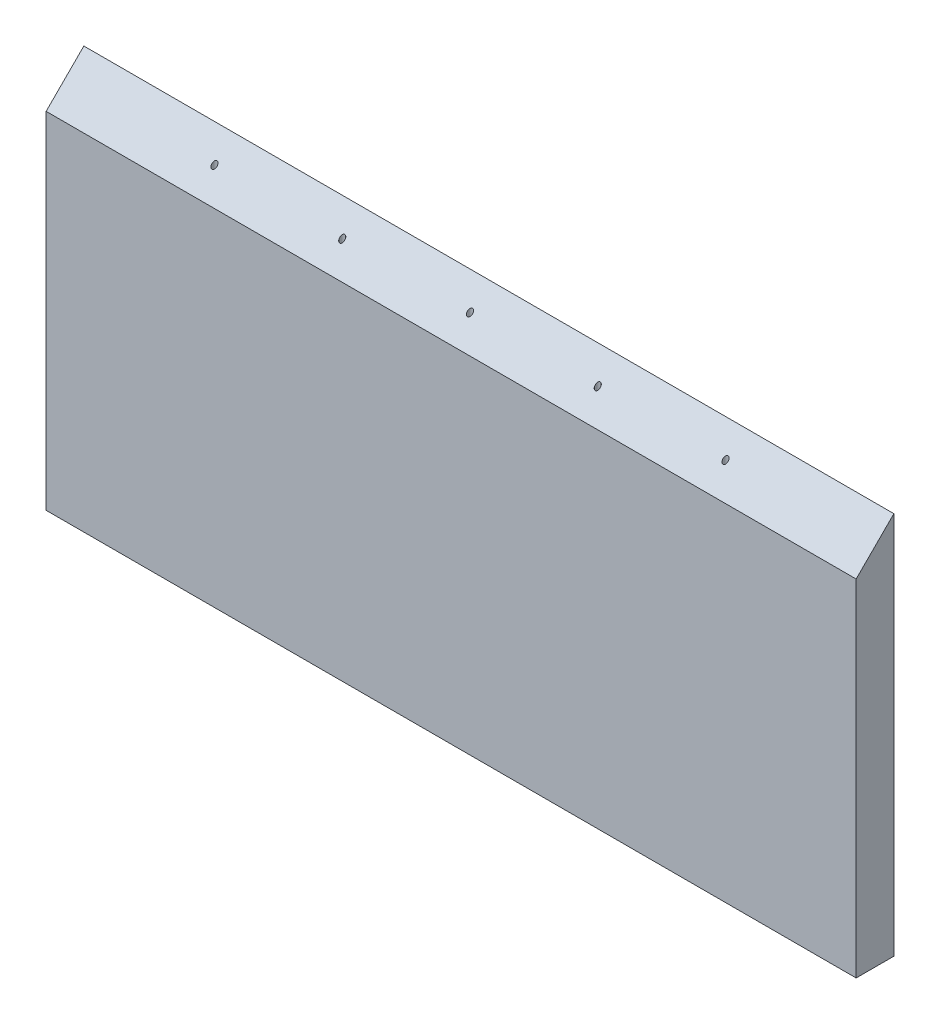
ISO-10303-21;
HEADER;
FILE_DESCRIPTION(('STEP AP214'),'2;1');
FILE_NAME('part.step','',(''),(''),'','','');
FILE_SCHEMA(('AUTOMOTIVE_DESIGN { 1 0 10303 214 1 1 1 1 }'));
ENDSEC;
DATA;
#1=APPLICATION_CONTEXT('core data for automotive mechanical design processes');
#2=APPLICATION_PROTOCOL_DEFINITION('international standard','automotive_design',2000,#1);
#3=PRODUCT_CONTEXT('',#1,'mechanical');
#4=PRODUCT('Part','Part','',(#3));
#5=PRODUCT_RELATED_PRODUCT_CATEGORY('part','',(#4));
#6=PRODUCT_DEFINITION_FORMATION('','',#4);
#7=PRODUCT_DEFINITION_CONTEXT('part definition',#1,'design');
#8=PRODUCT_DEFINITION('design','',#6,#7);
#9=PRODUCT_DEFINITION_SHAPE('','',#8);
#10=(LENGTH_UNIT() NAMED_UNIT(*) SI_UNIT(.MILLI.,.METRE.));
#11=(NAMED_UNIT(*) PLANE_ANGLE_UNIT() SI_UNIT($,.RADIAN.));
#12=(NAMED_UNIT(*) SI_UNIT($,.STERADIAN.) SOLID_ANGLE_UNIT());
#13=UNCERTAINTY_MEASURE_WITH_UNIT(LENGTH_MEASURE(1.E-05),#10,'distance_accuracy_value','');
#14=(GEOMETRIC_REPRESENTATION_CONTEXT(3) GLOBAL_UNCERTAINTY_ASSIGNED_CONTEXT((#13)) GLOBAL_UNIT_ASSIGNED_CONTEXT((#10,
#11,#12)) REPRESENTATION_CONTEXT('',''));
#15=CARTESIAN_POINT('',(0.,0.,0.));
#16=DIRECTION('',(0.,0.,1.));
#17=DIRECTION('',(1.,0.,0.));
#18=AXIS2_PLACEMENT_3D('',#15,#16,#17);
#19=CARTESIAN_POINT('',(0.,0.,15.));
#20=DIRECTION('',(1.,0.,0.));
#21=DIRECTION('',(0.,0.,-1.));
#22=AXIS2_PLACEMENT_3D('',#19,#20,#21);
#23=PLANE('',#22);
#24=DIRECTION('',(0.,-1.,0.));
#25=VECTOR('',#24,1.);
#26=CARTESIAN_POINT('',(0.,0.,15.));
#27=LINE('',#26,#25);
#28=CARTESIAN_POINT('',(0.,137.4,15.));
#29=VERTEX_POINT('',#28);
#30=CARTESIAN_POINT('',(0.,0.,15.));
#31=VERTEX_POINT('',#30);
#32=EDGE_CURVE('E92',#29,#31,#27,.T.);
#33=ORIENTED_EDGE('',*,*,#32,.F.);
#34=DIRECTION('',(0.,-0.707106781186547,0.707106781186548));
#35=VECTOR('',#34,1.);
#36=CARTESIAN_POINT('',(0.,152.4,0.));
#37=LINE('',#36,#35);
#38=CARTESIAN_POINT('',(0.,152.4,0.));
#39=VERTEX_POINT('',#38);
#40=EDGE_CURVE('E81',#39,#29,#37,.T.);
#41=ORIENTED_EDGE('',*,*,#40,.F.);
#42=DIRECTION('',(0.,-1.,0.));
#43=VECTOR('',#42,1.);
#44=CARTESIAN_POINT('',(0.,0.,0.));
#45=LINE('',#44,#43);
#46=CARTESIAN_POINT('',(0.,0.,0.));
#47=VERTEX_POINT('',#46);
#48=EDGE_CURVE('E91',#39,#47,#45,.T.);
#49=ORIENTED_EDGE('',*,*,#48,.T.);
#50=DIRECTION('',(0.,0.,-1.));
#51=VECTOR('',#50,1.);
#52=CARTESIAN_POINT('',(0.,0.,15.));
#53=LINE('',#52,#51);
#54=EDGE_CURVE('E11',#31,#47,#53,.T.);
#55=ORIENTED_EDGE('',*,*,#54,.F.);
#56=EDGE_LOOP('',(#33,#41,#49,#55));
#57=FACE_BOUND('',#56,.T.);
#58=ADVANCED_FACE('F34',(#57),#23,.F.);
#59=CARTESIAN_POINT('',(0.,0.,15.));
#60=DIRECTION('',(0.,1.,0.));
#61=DIRECTION('',(0.,0.,1.));
#62=AXIS2_PLACEMENT_3D('',#59,#60,#61);
#63=PLANE('',#62);
#64=DIRECTION('',(1.,0.,0.));
#65=VECTOR('',#64,1.);
#66=CARTESIAN_POINT('',(0.,0.,0.));
#67=LINE('',#66,#65);
#68=CARTESIAN_POINT('',(322.1,0.,0.));
#69=VERTEX_POINT('',#68);
#70=EDGE_CURVE('E62',#47,#69,#67,.T.);
#71=ORIENTED_EDGE('',*,*,#70,.T.);
#72=DIRECTION('',(0.,0.,-1.));
#73=VECTOR('',#72,1.);
#74=CARTESIAN_POINT('',(322.1,0.,15.));
#75=LINE('',#74,#73);
#76=CARTESIAN_POINT('',(322.1,0.,15.));
#77=VERTEX_POINT('',#76);
#78=EDGE_CURVE('E43',#77,#69,#75,.T.);
#79=ORIENTED_EDGE('',*,*,#78,.F.);
#80=DIRECTION('',(1.,0.,0.));
#81=VECTOR('',#80,1.);
#82=CARTESIAN_POINT('',(0.,0.,15.));
#83=LINE('',#82,#81);
#84=EDGE_CURVE('E51',#31,#77,#83,.T.);
#85=ORIENTED_EDGE('',*,*,#84,.F.);
#86=ORIENTED_EDGE('',*,*,#54,.T.);
#87=EDGE_LOOP('',(#71,#79,#85,#86));
#88=FACE_BOUND('',#87,.T.);
#89=ADVANCED_FACE('F137',(#88),#63,.F.);
#90=CARTESIAN_POINT('',(322.1,0.,15.));
#91=DIRECTION('',(-1.,0.,0.));
#92=DIRECTION('',(0.,0.,1.));
#93=AXIS2_PLACEMENT_3D('',#90,#91,#92);
#94=PLANE('',#93);
#95=DIRECTION('',(0.,1.,0.));
#96=VECTOR('',#95,1.);
#97=CARTESIAN_POINT('',(322.1,0.,0.));
#98=LINE('',#97,#96);
#99=CARTESIAN_POINT('',(322.1,152.4,0.));
#100=VERTEX_POINT('',#99);
#101=EDGE_CURVE('E84',#69,#100,#98,.T.);
#102=ORIENTED_EDGE('',*,*,#101,.T.);
#103=DIRECTION('',(0.,-0.707106781186547,0.707106781186548));
#104=VECTOR('',#103,1.);
#105=CARTESIAN_POINT('',(322.1,152.4,0.));
#106=LINE('',#105,#104);
#107=CARTESIAN_POINT('',(322.1,137.4,15.));
#108=VERTEX_POINT('',#107);
#109=EDGE_CURVE('E69',#100,#108,#106,.T.);
#110=ORIENTED_EDGE('',*,*,#109,.T.);
#111=DIRECTION('',(0.,1.,0.));
#112=VECTOR('',#111,1.);
#113=CARTESIAN_POINT('',(322.1,0.,15.));
#114=LINE('',#113,#112);
#115=EDGE_CURVE('E97',#77,#108,#114,.T.);
#116=ORIENTED_EDGE('',*,*,#115,.F.);
#117=ORIENTED_EDGE('',*,*,#78,.T.);
#118=EDGE_LOOP('',(#102,#110,#116,#117));
#119=FACE_BOUND('',#118,.T.);
#120=ADVANCED_FACE('F85',(#119),#94,.F.);
#121=CARTESIAN_POINT('',(0.,0.,15.));
#122=DIRECTION('',(0.,0.,-1.));
#123=DIRECTION('',(-1.,0.,0.));
#124=AXIS2_PLACEMENT_3D('',#121,#122,#123);
#125=PLANE('',#124);
#126=ORIENTED_EDGE('',*,*,#115,.T.);
#127=DIRECTION('',(-1.,0.,0.));
#128=VECTOR('',#127,1.);
#129=CARTESIAN_POINT('',(322.1,137.4,15.));
#130=LINE('',#129,#128);
#131=EDGE_CURVE('E78',#108,#29,#130,.T.);
#132=ORIENTED_EDGE('',*,*,#131,.T.);
#133=ORIENTED_EDGE('',*,*,#32,.T.);
#134=ORIENTED_EDGE('',*,*,#84,.T.);
#135=EDGE_LOOP('',(#126,#132,#133,#134));
#136=FACE_BOUND('',#135,.T.);
#137=ADVANCED_FACE('F136',(#136),#125,.F.);
#138=CARTESIAN_POINT('',(0.,0.,0.));
#139=DIRECTION('',(0.,0.,-1.));
#140=DIRECTION('',(-1.,0.,0.));
#141=AXIS2_PLACEMENT_3D('',#138,#139,#140);
#142=PLANE('',#141);
#143=ORIENTED_EDGE('',*,*,#48,.F.);
#144=DIRECTION('',(-1.,0.,0.));
#145=VECTOR('',#144,1.);
#146=CARTESIAN_POINT('',(0.,152.4,0.));
#147=LINE('',#146,#145);
#148=EDGE_CURVE('E75',#100,#39,#147,.T.);
#149=ORIENTED_EDGE('',*,*,#148,.F.);
#150=ORIENTED_EDGE('',*,*,#101,.F.);
#151=ORIENTED_EDGE('',*,*,#70,.F.);
#152=EDGE_LOOP('',(#143,#149,#150,#151));
#153=FACE_BOUND('',#152,.T.);
#154=ADVANCED_FACE('F89',(#153),#142,.T.);
#155=CARTESIAN_POINT('',(322.1,152.4,0.));
#156=DIRECTION('',(0.,-0.707106781186548,-0.707106781186547));
#157=DIRECTION('',(0.,0.707106781186547,-0.707106781186548));
#158=AXIS2_PLACEMENT_3D('',#155,#156,#157);
#159=PLANE('',#158);
#160=CARTESIAN_POINT('',(161.05,144.9,7.5));
#161=DIRECTION('',(0.,-0.707106781186548,-0.707106781186547));
#162=DIRECTION('',(0.,0.707106781186547,-0.707106781186548));
#163=AXIS2_PLACEMENT_3D('',#160,#161,#162);
#164=ELLIPSE('',#163,1.41421356237309,0.999999999999998);
#165=CARTESIAN_POINT('',(161.05,145.9,6.5));
#166=VERTEX_POINT('',#165);
#167=EDGE_CURVE('E117',#166,#166,#164,.T.);
#168=ORIENTED_EDGE('',*,*,#167,.T.);
#169=EDGE_LOOP('',(#168));
#170=FACE_BOUND('',#169,.T.);
#171=CARTESIAN_POINT('',(59.45,144.899999999999,7.50000000000071));
#172=DIRECTION('',(0.,-0.707106781186548,-0.707106781186547));
#173=DIRECTION('',(0.,0.707106781186547,-0.707106781186548));
#174=AXIS2_PLACEMENT_3D('',#171,#172,#173);
#175=ELLIPSE('',#174,1.41421356237309,0.999999999999998);
#176=CARTESIAN_POINT('',(59.45,145.899999999999,6.50000000000071));
#177=VERTEX_POINT('',#176);
#178=EDGE_CURVE('E124',#177,#177,#175,.T.);
#179=ORIENTED_EDGE('',*,*,#178,.T.);
#180=EDGE_LOOP('',(#179));
#181=FACE_BOUND('',#180,.T.);
#182=CARTESIAN_POINT('',(110.25,144.9,7.50000000000035));
#183=DIRECTION('',(0.,-0.707106781186548,-0.707106781186547));
#184=DIRECTION('',(0.,0.707106781186547,-0.707106781186548));
#185=AXIS2_PLACEMENT_3D('',#182,#183,#184);
#186=ELLIPSE('',#185,1.41421356237309,0.999999999999998);
#187=CARTESIAN_POINT('',(110.25,145.9,6.50000000000036));
#188=VERTEX_POINT('',#187);
#189=EDGE_CURVE('E127',#188,#188,#186,.T.);
#190=ORIENTED_EDGE('',*,*,#189,.T.);
#191=EDGE_LOOP('',(#190));
#192=FACE_BOUND('',#191,.T.);
#193=CARTESIAN_POINT('',(262.65,144.9,7.5));
#194=DIRECTION('',(0.,-0.707106781186548,-0.707106781186547));
#195=DIRECTION('',(0.,0.707106781186547,-0.707106781186548));
#196=AXIS2_PLACEMENT_3D('',#193,#194,#195);
#197=ELLIPSE('',#196,1.41421356237309,0.999999999999998);
#198=CARTESIAN_POINT('',(262.65,145.9,6.5));
#199=VERTEX_POINT('',#198);
#200=EDGE_CURVE('E130',#199,#199,#197,.T.);
#201=ORIENTED_EDGE('',*,*,#200,.T.);
#202=EDGE_LOOP('',(#201));
#203=FACE_BOUND('',#202,.T.);
#204=CARTESIAN_POINT('',(211.85,144.9,7.5));
#205=DIRECTION('',(0.,-0.707106781186548,-0.707106781186547));
#206=DIRECTION('',(0.,0.707106781186547,-0.707106781186548));
#207=AXIS2_PLACEMENT_3D('',#204,#205,#206);
#208=ELLIPSE('',#207,1.41421356237309,0.999999999999998);
#209=CARTESIAN_POINT('',(211.85,145.9,6.5));
#210=VERTEX_POINT('',#209);
#211=EDGE_CURVE('E37',#210,#210,#208,.T.);
#212=ORIENTED_EDGE('',*,*,#211,.T.);
#213=EDGE_LOOP('',(#212));
#214=FACE_BOUND('',#213,.T.);
#215=ORIENTED_EDGE('',*,*,#40,.T.);
#216=ORIENTED_EDGE('',*,*,#131,.F.);
#217=ORIENTED_EDGE('',*,*,#109,.F.);
#218=ORIENTED_EDGE('',*,*,#148,.T.);
#219=EDGE_LOOP('',(#215,#216,#217,#218));
#220=FACE_BOUND('',#219,.T.);
#221=ADVANCED_FACE('F72',(#170,#181,#192,#203,#214,#220),#159,.F.);
#222=CARTESIAN_POINT('',(262.65,101.6,7.5));
#223=DIRECTION('',(0.,-1.,0.));
#224=DIRECTION('',(0.,0.,-1.));
#225=AXIS2_PLACEMENT_3D('',#222,#223,#224);
#226=PLANE('',#225);
#227=CARTESIAN_POINT('',(262.65,101.6,7.5));
#228=DIRECTION('',(0.,-1.,0.));
#229=DIRECTION('',(0.,0.,-1.));
#230=AXIS2_PLACEMENT_3D('',#227,#228,#229);
#231=CIRCLE('',#230,0.999999999999998);
#232=CARTESIAN_POINT('',(262.65,101.6,6.5));
#233=VERTEX_POINT('',#232);
#234=EDGE_CURVE('E110',#233,#233,#231,.T.);
#235=ORIENTED_EDGE('',*,*,#234,.F.);
#236=EDGE_LOOP('',(#235));
#237=FACE_BOUND('',#236,.T.);
#238=ADVANCED_FACE('F179',(#237),#226,.F.);
#239=CARTESIAN_POINT('',(262.65,101.6,7.5));
#240=DIRECTION('',(0.,1.,0.));
#241=DIRECTION('',(0.,0.,1.));
#242=AXIS2_PLACEMENT_3D('',#239,#240,#241);
#243=CYLINDRICAL_SURFACE('',#242,0.999999999999998);
#244=ORIENTED_EDGE('',*,*,#200,.F.);
#245=EDGE_LOOP('',(#244));
#246=FACE_BOUND('',#245,.T.);
#247=ORIENTED_EDGE('',*,*,#234,.T.);
#248=EDGE_LOOP('',(#247));
#249=FACE_BOUND('',#248,.T.);
#250=ADVANCED_FACE('F175',(#246,#249),#243,.F.);
#251=CARTESIAN_POINT('',(110.25,101.6,7.50000000000035));
#252=DIRECTION('',(0.,-1.,0.));
#253=DIRECTION('',(0.,0.,-1.));
#254=AXIS2_PLACEMENT_3D('',#251,#252,#253);
#255=PLANE('',#254);
#256=CARTESIAN_POINT('',(110.25,101.6,7.50000000000035));
#257=DIRECTION('',(0.,-1.,0.));
#258=DIRECTION('',(0.,0.,-1.));
#259=AXIS2_PLACEMENT_3D('',#256,#257,#258);
#260=CIRCLE('',#259,0.999999999999998);
#261=CARTESIAN_POINT('',(110.25,101.6,6.50000000000036));
#262=VERTEX_POINT('',#261);
#263=EDGE_CURVE('E116',#262,#262,#260,.T.);
#264=ORIENTED_EDGE('',*,*,#263,.F.);
#265=EDGE_LOOP('',(#264));
#266=FACE_BOUND('',#265,.T.);
#267=ADVANCED_FACE('F171',(#266),#255,.F.);
#268=CARTESIAN_POINT('',(110.25,101.6,7.50000000000035));
#269=DIRECTION('',(0.,1.,0.));
#270=DIRECTION('',(0.,0.,1.));
#271=AXIS2_PLACEMENT_3D('',#268,#269,#270);
#272=CYLINDRICAL_SURFACE('',#271,0.999999999999998);
#273=ORIENTED_EDGE('',*,*,#189,.F.);
#274=EDGE_LOOP('',(#273));
#275=FACE_BOUND('',#274,.T.);
#276=ORIENTED_EDGE('',*,*,#263,.T.);
#277=EDGE_LOOP('',(#276));
#278=FACE_BOUND('',#277,.T.);
#279=ADVANCED_FACE('F167',(#275,#278),#272,.F.);
#280=CARTESIAN_POINT('',(59.45,101.6,7.50000000000071));
#281=DIRECTION('',(0.,-1.,0.));
#282=DIRECTION('',(0.,0.,-1.));
#283=AXIS2_PLACEMENT_3D('',#280,#281,#282);
#284=PLANE('',#283);
#285=CARTESIAN_POINT('',(59.45,101.6,7.50000000000071));
#286=DIRECTION('',(0.,-1.,0.));
#287=DIRECTION('',(0.,0.,-1.));
#288=AXIS2_PLACEMENT_3D('',#285,#286,#287);
#289=CIRCLE('',#288,0.999999999999998);
#290=CARTESIAN_POINT('',(59.45,101.6,6.50000000000071));
#291=VERTEX_POINT('',#290);
#292=EDGE_CURVE('E113',#291,#291,#289,.T.);
#293=ORIENTED_EDGE('',*,*,#292,.F.);
#294=EDGE_LOOP('',(#293));
#295=FACE_BOUND('',#294,.T.);
#296=ADVANCED_FACE('F163',(#295),#284,.F.);
#297=CARTESIAN_POINT('',(59.45,101.6,7.50000000000071));
#298=DIRECTION('',(0.,1.,0.));
#299=DIRECTION('',(0.,0.,1.));
#300=AXIS2_PLACEMENT_3D('',#297,#298,#299);
#301=CYLINDRICAL_SURFACE('',#300,0.999999999999998);
#302=ORIENTED_EDGE('',*,*,#178,.F.);
#303=EDGE_LOOP('',(#302));
#304=FACE_BOUND('',#303,.T.);
#305=ORIENTED_EDGE('',*,*,#292,.T.);
#306=EDGE_LOOP('',(#305));
#307=FACE_BOUND('',#306,.T.);
#308=ADVANCED_FACE('F159',(#304,#307),#301,.F.);
#309=CARTESIAN_POINT('',(161.05,101.6,7.5));
#310=DIRECTION('',(0.,-1.,0.));
#311=DIRECTION('',(0.,0.,-1.));
#312=AXIS2_PLACEMENT_3D('',#309,#310,#311);
#313=PLANE('',#312);
#314=CARTESIAN_POINT('',(161.05,101.6,7.5));
#315=DIRECTION('',(0.,-1.,0.));
#316=DIRECTION('',(0.,0.,-1.));
#317=AXIS2_PLACEMENT_3D('',#314,#315,#316);
#318=CIRCLE('',#317,0.999999999999998);
#319=CARTESIAN_POINT('',(161.05,101.6,6.5));
#320=VERTEX_POINT('',#319);
#321=EDGE_CURVE('E101',#320,#320,#318,.T.);
#322=ORIENTED_EDGE('',*,*,#321,.F.);
#323=EDGE_LOOP('',(#322));
#324=FACE_BOUND('',#323,.T.);
#325=ADVANCED_FACE('F155',(#324),#313,.F.);
#326=CARTESIAN_POINT('',(161.05,101.6,7.5));
#327=DIRECTION('',(0.,1.,0.));
#328=DIRECTION('',(0.,0.,1.));
#329=AXIS2_PLACEMENT_3D('',#326,#327,#328);
#330=CYLINDRICAL_SURFACE('',#329,0.999999999999998);
#331=ORIENTED_EDGE('',*,*,#167,.F.);
#332=EDGE_LOOP('',(#331));
#333=FACE_BOUND('',#332,.T.);
#334=ORIENTED_EDGE('',*,*,#321,.T.);
#335=EDGE_LOOP('',(#334));
#336=FACE_BOUND('',#335,.T.);
#337=ADVANCED_FACE('F151',(#333,#336),#330,.F.);
#338=CARTESIAN_POINT('',(211.85,101.6,7.5));
#339=DIRECTION('',(0.,-1.,0.));
#340=DIRECTION('',(0.,0.,-1.));
#341=AXIS2_PLACEMENT_3D('',#338,#339,#340);
#342=PLANE('',#341);
#343=CARTESIAN_POINT('',(211.85,101.6,7.5));
#344=DIRECTION('',(0.,-1.,0.));
#345=DIRECTION('',(0.,0.,-1.));
#346=AXIS2_PLACEMENT_3D('',#343,#344,#345);
#347=CIRCLE('',#346,0.999999999999998);
#348=CARTESIAN_POINT('',(211.85,101.6,6.5));
#349=VERTEX_POINT('',#348);
#350=EDGE_CURVE('E105',#349,#349,#347,.T.);
#351=ORIENTED_EDGE('',*,*,#350,.F.);
#352=EDGE_LOOP('',(#351));
#353=FACE_BOUND('',#352,.T.);
#354=ADVANCED_FACE('F154',(#353),#342,.F.);
#355=CARTESIAN_POINT('',(211.85,101.6,7.5));
#356=DIRECTION('',(0.,1.,0.));
#357=DIRECTION('',(0.,0.,1.));
#358=AXIS2_PLACEMENT_3D('',#355,#356,#357);
#359=CYLINDRICAL_SURFACE('',#358,0.999999999999998);
#360=ORIENTED_EDGE('',*,*,#211,.F.);
#361=EDGE_LOOP('',(#360));
#362=FACE_BOUND('',#361,.T.);
#363=ORIENTED_EDGE('',*,*,#350,.T.);
#364=EDGE_LOOP('',(#363));
#365=FACE_BOUND('',#364,.T.);
#366=ADVANCED_FACE('F184',(#362,#365),#359,.F.);
#367=CLOSED_SHELL('',(#58,#89,#120,#137,#154,#221,#238,#250,#267,#279,#296,#308,#325,#337,#354,#366));
#368=MANIFOLD_SOLID_BREP('B2',#367);
#369=ADVANCED_BREP_SHAPE_REPRESENTATION('',(#18,#368),#14);
#370=SHAPE_DEFINITION_REPRESENTATION(#9,#369);
ENDSEC;
END-ISO-10303-21;
